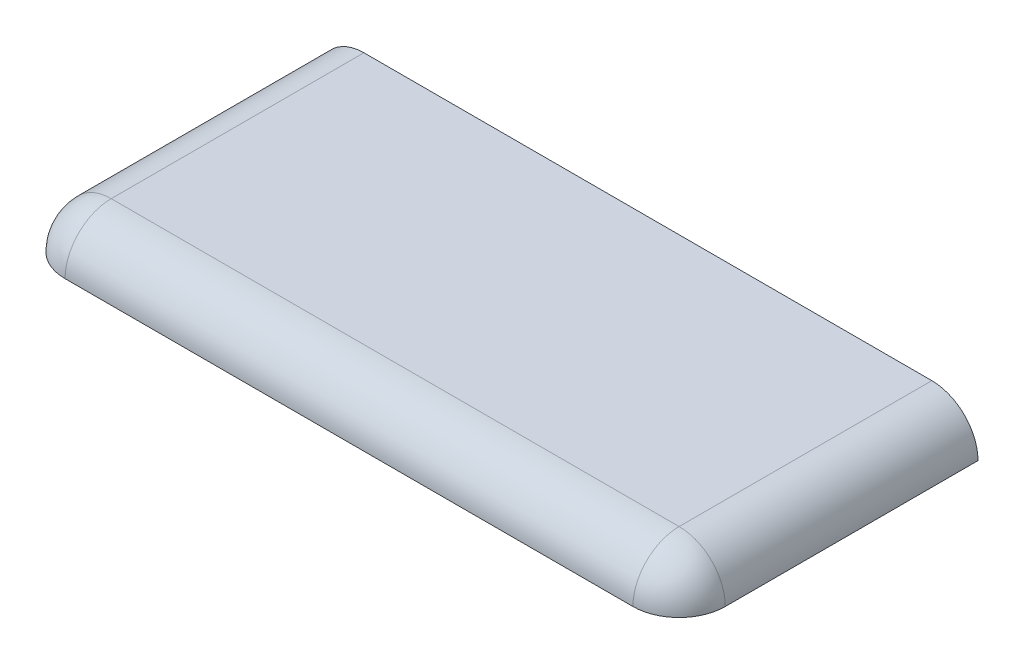
ISO-10303-21;
HEADER;
FILE_DESCRIPTION(('STEP AP214'),'2;1');
FILE_NAME('part.step','',(''),(''),'','','');
FILE_SCHEMA(('AUTOMOTIVE_DESIGN { 1 0 10303 214 1 1 1 1 }'));
ENDSEC;
DATA;
#1=APPLICATION_CONTEXT('core data for automotive mechanical design processes');
#2=APPLICATION_PROTOCOL_DEFINITION('international standard','automotive_design',2000,#1);
#3=PRODUCT_CONTEXT('',#1,'mechanical');
#4=PRODUCT('Part','Part','',(#3));
#5=PRODUCT_RELATED_PRODUCT_CATEGORY('part','',(#4));
#6=PRODUCT_DEFINITION_FORMATION('','',#4);
#7=PRODUCT_DEFINITION_CONTEXT('part definition',#1,'design');
#8=PRODUCT_DEFINITION('design','',#6,#7);
#9=PRODUCT_DEFINITION_SHAPE('','',#8);
#10=(LENGTH_UNIT() NAMED_UNIT(*) SI_UNIT(.MILLI.,.METRE.));
#11=(NAMED_UNIT(*) PLANE_ANGLE_UNIT() SI_UNIT($,.RADIAN.));
#12=(NAMED_UNIT(*) SI_UNIT($,.STERADIAN.) SOLID_ANGLE_UNIT());
#13=UNCERTAINTY_MEASURE_WITH_UNIT(LENGTH_MEASURE(1.E-05),#10,'distance_accuracy_value','');
#14=(GEOMETRIC_REPRESENTATION_CONTEXT(3) GLOBAL_UNCERTAINTY_ASSIGNED_CONTEXT((#13)) GLOBAL_UNIT_ASSIGNED_CONTEXT((#10,
#11,#12)) REPRESENTATION_CONTEXT('',''));
#15=CARTESIAN_POINT('',(0.,0.,0.));
#16=DIRECTION('',(0.,0.,1.));
#17=DIRECTION('',(1.,0.,0.));
#18=AXIS2_PLACEMENT_3D('',#15,#16,#17);
#19=CARTESIAN_POINT('',(18.1553373675499,2.54,-8.21897029476919));
#20=DIRECTION('',(0.,0.,1.));
#21=DIRECTION('',(1.,0.,0.));
#22=AXIS2_PLACEMENT_3D('',#19,#20,#21);
#23=PLANE('',#22);
#24=DIRECTION('',(-1.,0.,0.));
#25=VECTOR('',#24,1.);
#26=CARTESIAN_POINT('',(18.1553373675499,0.,-8.21897029476919));
#27=LINE('',#26,#25);
#28=CARTESIAN_POINT('',(18.1553373675499,0.,-8.21897029476919));
#29=VERTEX_POINT('',#28);
#30=CARTESIAN_POINT('',(-18.1553373675499,0.,-8.21897029476919));
#31=VERTEX_POINT('',#30);
#32=EDGE_CURVE('E84',#29,#31,#27,.T.);
#33=ORIENTED_EDGE('',*,*,#32,.T.);
#34=CARTESIAN_POINT('',(-15.6153373675499,0.,-8.21897029476919));
#35=DIRECTION('',(0.,0.,1.));
#36=DIRECTION('',(1.,0.,0.));
#37=AXIS2_PLACEMENT_3D('',#34,#35,#36);
#38=CIRCLE('',#37,2.54);
#39=CARTESIAN_POINT('',(-15.6153373675499,2.54,-8.21897029476919));
#40=VERTEX_POINT('',#39);
#41=EDGE_CURVE('E12',#31,#40,#38,.F.);
#42=ORIENTED_EDGE('',*,*,#41,.T.);
#43=DIRECTION('',(-1.,0.,0.));
#44=VECTOR('',#43,1.);
#45=CARTESIAN_POINT('',(18.1553373675499,2.54,-8.21897029476919));
#46=LINE('',#45,#44);
#47=CARTESIAN_POINT('',(15.6153373675499,2.54,-8.21897029476919));
#48=VERTEX_POINT('',#47);
#49=EDGE_CURVE('E86',#48,#40,#46,.T.);
#50=ORIENTED_EDGE('',*,*,#49,.F.);
#51=CARTESIAN_POINT('',(15.6153373675499,0.,-8.21897029476919));
#52=DIRECTION('',(0.,0.,1.));
#53=DIRECTION('',(1.,0.,0.));
#54=AXIS2_PLACEMENT_3D('',#51,#52,#53);
#55=CIRCLE('',#54,2.54);
#56=EDGE_CURVE('E46',#48,#29,#55,.F.);
#57=ORIENTED_EDGE('',*,*,#56,.T.);
#58=EDGE_LOOP('',(#33,#42,#50,#57));
#59=FACE_BOUND('',#58,.T.);
#60=ADVANCED_FACE('F37',(#59),#23,.F.);
#61=CARTESIAN_POINT('',(0.,2.54,0.));
#62=DIRECTION('',(0.,1.,0.));
#63=DIRECTION('',(0.,0.,1.));
#64=AXIS2_PLACEMENT_3D('',#61,#62,#63);
#65=PLANE('',#64);
#66=ORIENTED_EDGE('',*,*,#49,.T.);
#67=DIRECTION('',(0.,0.,1.));
#68=VECTOR('',#67,1.);
#69=CARTESIAN_POINT('',(-15.6153373675499,2.54,5.67897029476919));
#70=LINE('',#69,#68);
#71=CARTESIAN_POINT('',(-15.6153373675499,2.54,5.67897029476919));
#72=VERTEX_POINT('',#71);
#73=EDGE_CURVE('E89',#40,#72,#70,.T.);
#74=ORIENTED_EDGE('',*,*,#73,.T.);
#75=DIRECTION('',(1.,0.,0.));
#76=VECTOR('',#75,1.);
#77=CARTESIAN_POINT('',(18.1553373675499,2.54,5.67897029476919));
#78=LINE('',#77,#76);
#79=CARTESIAN_POINT('',(15.6153373675499,2.54,5.67897029476919));
#80=VERTEX_POINT('',#79);
#81=EDGE_CURVE('E105',#72,#80,#78,.T.);
#82=ORIENTED_EDGE('',*,*,#81,.T.);
#83=DIRECTION('',(0.,0.,-1.));
#84=VECTOR('',#83,1.);
#85=CARTESIAN_POINT('',(15.6153373675499,2.54,-8.21897029476919));
#86=LINE('',#85,#84);
#87=EDGE_CURVE('E59',#80,#48,#86,.T.);
#88=ORIENTED_EDGE('',*,*,#87,.T.);
#89=EDGE_LOOP('',(#66,#74,#82,#88));
#90=FACE_BOUND('',#89,.T.);
#91=ADVANCED_FACE('F130',(#90),#65,.T.);
#92=CARTESIAN_POINT('',(0.,0.,0.));
#93=DIRECTION('',(0.,1.,0.));
#94=DIRECTION('',(0.,0.,1.));
#95=AXIS2_PLACEMENT_3D('',#92,#93,#94);
#96=PLANE('',#95);
#97=DIRECTION('',(0.,0.,-1.));
#98=VECTOR('',#97,1.);
#99=CARTESIAN_POINT('',(18.1553373675499,0.,8.21897029476919));
#100=LINE('',#99,#98);
#101=CARTESIAN_POINT('',(18.1553373675499,0.,5.67897029476919));
#102=VERTEX_POINT('',#101);
#103=EDGE_CURVE('E93',#102,#29,#100,.T.);
#104=ORIENTED_EDGE('',*,*,#103,.F.);
#105=CARTESIAN_POINT('',(15.6153373675499,0.,5.67897029476919));
#106=DIRECTION('',(0.,1.,0.));
#107=DIRECTION('',(0.,0.,1.));
#108=AXIS2_PLACEMENT_3D('',#105,#106,#107);
#109=CIRCLE('',#108,2.54);
#110=CARTESIAN_POINT('',(15.6153373675499,0.,8.21897029476919));
#111=VERTEX_POINT('',#110);
#112=EDGE_CURVE('E109',#102,#111,#109,.F.);
#113=ORIENTED_EDGE('',*,*,#112,.T.);
#114=DIRECTION('',(1.,0.,0.));
#115=VECTOR('',#114,1.);
#116=CARTESIAN_POINT('',(18.1553373675499,0.,8.21897029476919));
#117=LINE('',#116,#115);
#118=CARTESIAN_POINT('',(-15.6153373675499,0.,8.21897029476919));
#119=VERTEX_POINT('',#118);
#120=EDGE_CURVE('E99',#119,#111,#117,.T.);
#121=ORIENTED_EDGE('',*,*,#120,.F.);
#122=CARTESIAN_POINT('',(-15.6153373675499,0.,5.67897029476919));
#123=DIRECTION('',(0.,1.,0.));
#124=DIRECTION('',(0.,0.,1.));
#125=AXIS2_PLACEMENT_3D('',#122,#123,#124);
#126=CIRCLE('',#125,2.54);
#127=CARTESIAN_POINT('',(-18.1553373675499,0.,5.67897029476919));
#128=VERTEX_POINT('',#127);
#129=EDGE_CURVE('E107',#119,#128,#126,.F.);
#130=ORIENTED_EDGE('',*,*,#129,.T.);
#131=DIRECTION('',(0.,0.,1.));
#132=VECTOR('',#131,1.);
#133=CARTESIAN_POINT('',(-18.1553373675499,0.,8.21897029476919));
#134=LINE('',#133,#132);
#135=EDGE_CURVE('E96',#31,#128,#134,.T.);
#136=ORIENTED_EDGE('',*,*,#135,.F.);
#137=ORIENTED_EDGE('',*,*,#32,.F.);
#138=EDGE_LOOP('',(#104,#113,#121,#130,#136,#137));
#139=FACE_BOUND('',#138,.T.);
#140=ADVANCED_FACE('F92',(#139),#96,.F.);
#141=CARTESIAN_POINT('',(0.,0.,5.67897029476919));
#142=DIRECTION('',(-1.,0.,0.));
#143=DIRECTION('',(0.,0.,1.));
#144=AXIS2_PLACEMENT_3D('',#141,#142,#143);
#145=CYLINDRICAL_SURFACE('',#144,2.54);
#146=ORIENTED_EDGE('',*,*,#81,.F.);
#147=CARTESIAN_POINT('',(-15.6153373675499,0.,5.67897029476919));
#148=DIRECTION('',(-1.,0.,0.));
#149=DIRECTION('',(0.,0.,1.));
#150=AXIS2_PLACEMENT_3D('',#147,#148,#149);
#151=CIRCLE('',#150,2.54);
#152=EDGE_CURVE('E114',#72,#119,#151,.F.);
#153=ORIENTED_EDGE('',*,*,#152,.T.);
#154=ORIENTED_EDGE('',*,*,#120,.T.);
#155=CARTESIAN_POINT('',(15.6153373675499,0.,5.67897029476919));
#156=DIRECTION('',(-1.,0.,0.));
#157=DIRECTION('',(0.,0.,1.));
#158=AXIS2_PLACEMENT_3D('',#155,#156,#157);
#159=CIRCLE('',#158,2.54);
#160=EDGE_CURVE('E111',#111,#80,#159,.T.);
#161=ORIENTED_EDGE('',*,*,#160,.T.);
#162=EDGE_LOOP('',(#146,#153,#154,#161));
#163=FACE_BOUND('',#162,.T.);
#164=ADVANCED_FACE('F128',(#163),#145,.T.);
#165=CARTESIAN_POINT('',(-15.6153373675499,0.,0.));
#166=DIRECTION('',(0.,0.,-1.));
#167=DIRECTION('',(-1.,0.,0.));
#168=AXIS2_PLACEMENT_3D('',#165,#166,#167);
#169=CYLINDRICAL_SURFACE('',#168,2.54);
#170=ORIENTED_EDGE('',*,*,#41,.F.);
#171=ORIENTED_EDGE('',*,*,#135,.T.);
#172=CARTESIAN_POINT('',(-15.6153373675499,0.,5.67897029476919));
#173=DIRECTION('',(0.,0.,1.));
#174=DIRECTION('',(1.,0.,0.));
#175=AXIS2_PLACEMENT_3D('',#172,#173,#174);
#176=CIRCLE('',#175,2.54);
#177=EDGE_CURVE('E118',#72,#128,#176,.T.);
#178=ORIENTED_EDGE('',*,*,#177,.F.);
#179=ORIENTED_EDGE('',*,*,#73,.F.);
#180=EDGE_LOOP('',(#170,#171,#178,#179));
#181=FACE_BOUND('',#180,.T.);
#182=ADVANCED_FACE('F133',(#181),#169,.T.);
#183=CARTESIAN_POINT('',(-15.6153373675499,0.,5.67897029476919));
#184=DIRECTION('',(0.,0.,1.));
#185=DIRECTION('',(1.,0.,0.));
#186=AXIS2_PLACEMENT_3D('',#183,#184,#185);
#187=SPHERICAL_SURFACE('',#186,2.54);
#188=ORIENTED_EDGE('',*,*,#177,.T.);
#189=ORIENTED_EDGE('',*,*,#129,.F.);
#190=ORIENTED_EDGE('',*,*,#152,.F.);
#191=EDGE_LOOP('',(#188,#189,#190));
#192=FACE_BOUND('',#191,.T.);
#193=ADVANCED_FACE('F134',(#192),#187,.T.);
#194=CARTESIAN_POINT('',(15.6153373675499,0.,0.));
#195=DIRECTION('',(0.,0.,1.));
#196=DIRECTION('',(1.,0.,0.));
#197=AXIS2_PLACEMENT_3D('',#194,#195,#196);
#198=CYLINDRICAL_SURFACE('',#197,2.54);
#199=ORIENTED_EDGE('',*,*,#56,.F.);
#200=ORIENTED_EDGE('',*,*,#87,.F.);
#201=CARTESIAN_POINT('',(15.6153373675499,0.,5.67897029476919));
#202=DIRECTION('',(0.,0.,1.));
#203=DIRECTION('',(1.,0.,0.));
#204=AXIS2_PLACEMENT_3D('',#201,#202,#203);
#205=CIRCLE('',#204,2.54);
#206=EDGE_CURVE('E41',#102,#80,#205,.T.);
#207=ORIENTED_EDGE('',*,*,#206,.F.);
#208=ORIENTED_EDGE('',*,*,#103,.T.);
#209=EDGE_LOOP('',(#199,#200,#207,#208));
#210=FACE_BOUND('',#209,.T.);
#211=ADVANCED_FACE('F39',(#210),#198,.T.);
#212=CARTESIAN_POINT('',(15.6153373675499,0.,5.67897029476919));
#213=DIRECTION('',(0.,0.,1.));
#214=DIRECTION('',(1.,0.,0.));
#215=AXIS2_PLACEMENT_3D('',#212,#213,#214);
#216=SPHERICAL_SURFACE('',#215,2.54);
#217=ORIENTED_EDGE('',*,*,#160,.F.);
#218=ORIENTED_EDGE('',*,*,#112,.F.);
#219=ORIENTED_EDGE('',*,*,#206,.T.);
#220=EDGE_LOOP('',(#217,#218,#219));
#221=FACE_BOUND('',#220,.T.);
#222=ADVANCED_FACE('F125',(#221),#216,.T.);
#223=CLOSED_SHELL('',(#60,#91,#140,#164,#182,#193,#211,#222));
#224=MANIFOLD_SOLID_BREP('B2',#223);
#225=ADVANCED_BREP_SHAPE_REPRESENTATION('',(#18,#224),#14);
#226=SHAPE_DEFINITION_REPRESENTATION(#9,#225);
ENDSEC;
END-ISO-10303-21;
